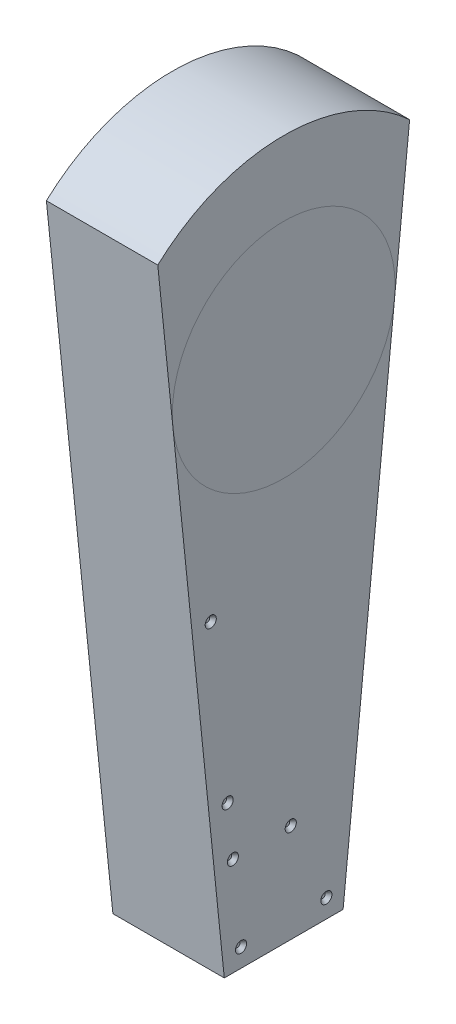
ISO-10303-21;
HEADER;
FILE_DESCRIPTION(('STEP AP214'),'2;1');
FILE_NAME('part.step','',(''),(''),'','','');
FILE_SCHEMA(('AUTOMOTIVE_DESIGN { 1 0 10303 214 1 1 1 1 }'));
ENDSEC;
DATA;
#1=APPLICATION_CONTEXT('core data for automotive mechanical design processes');
#2=APPLICATION_PROTOCOL_DEFINITION('international standard','automotive_design',2000,#1);
#3=PRODUCT_CONTEXT('',#1,'mechanical');
#4=PRODUCT('Part','Part','',(#3));
#5=PRODUCT_RELATED_PRODUCT_CATEGORY('part','',(#4));
#6=PRODUCT_DEFINITION_FORMATION('','',#4);
#7=PRODUCT_DEFINITION_CONTEXT('part definition',#1,'design');
#8=PRODUCT_DEFINITION('design','',#6,#7);
#9=PRODUCT_DEFINITION_SHAPE('','',#8);
#10=(LENGTH_UNIT() NAMED_UNIT(*) SI_UNIT(.MILLI.,.METRE.));
#11=(NAMED_UNIT(*) PLANE_ANGLE_UNIT() SI_UNIT($,.RADIAN.));
#12=(NAMED_UNIT(*) SI_UNIT($,.STERADIAN.) SOLID_ANGLE_UNIT());
#13=UNCERTAINTY_MEASURE_WITH_UNIT(LENGTH_MEASURE(1.E-05),#10,'distance_accuracy_value','');
#14=(GEOMETRIC_REPRESENTATION_CONTEXT(3) GLOBAL_UNCERTAINTY_ASSIGNED_CONTEXT((#13)) GLOBAL_UNIT_ASSIGNED_CONTEXT((#10,
#11,#12)) REPRESENTATION_CONTEXT('',''));
#15=CARTESIAN_POINT('',(0.,0.,0.));
#16=DIRECTION('',(0.,0.,1.));
#17=DIRECTION('',(1.,0.,0.));
#18=AXIS2_PLACEMENT_3D('',#15,#16,#17);
#19=CARTESIAN_POINT('',(76.2,-351.790000010146,40.64));
#20=DIRECTION('',(0.,1.,0.));
#21=DIRECTION('',(0.,0.,1.));
#22=AXIS2_PLACEMENT_3D('',#19,#20,#21);
#23=PLANE('',#22);
#24=DIRECTION('',(0.,0.,-1.));
#25=VECTOR('',#24,1.);
#26=CARTESIAN_POINT('',(0.,-351.790000010146,40.64));
#27=LINE('',#26,#25);
#28=CARTESIAN_POINT('',(0.,-351.790000010146,40.64));
#29=VERTEX_POINT('',#28);
#30=CARTESIAN_POINT('',(0.,-351.790000010146,-40.64));
#31=VERTEX_POINT('',#30);
#32=EDGE_CURVE('E101',#29,#31,#27,.T.);
#33=ORIENTED_EDGE('',*,*,#32,.T.);
#34=DIRECTION('',(-1.,0.,0.));
#35=VECTOR('',#34,1.);
#36=CARTESIAN_POINT('',(76.2,-351.790000010146,-40.64));
#37=LINE('',#36,#35);
#38=CARTESIAN_POINT('',(76.2,-351.790000010146,-40.64));
#39=VERTEX_POINT('',#38);
#40=EDGE_CURVE('E83',#39,#31,#37,.T.);
#41=ORIENTED_EDGE('',*,*,#40,.F.);
#42=DIRECTION('',(0.,0.,-1.));
#43=VECTOR('',#42,1.);
#44=CARTESIAN_POINT('',(76.2,-351.790000010146,40.64));
#45=LINE('',#44,#43);
#46=CARTESIAN_POINT('',(76.2,-351.790000010146,40.64));
#47=VERTEX_POINT('',#46);
#48=EDGE_CURVE('E90',#47,#39,#45,.T.);
#49=ORIENTED_EDGE('',*,*,#48,.F.);
#50=DIRECTION('',(-1.,0.,0.));
#51=VECTOR('',#50,1.);
#52=CARTESIAN_POINT('',(76.2,-351.790000010146,40.64));
#53=LINE('',#52,#51);
#54=EDGE_CURVE('E112',#47,#29,#53,.T.);
#55=ORIENTED_EDGE('',*,*,#54,.T.);
#56=EDGE_LOOP('',(#33,#41,#49,#55));
#57=FACE_BOUND('',#56,.T.);
#58=CARTESIAN_POINT('',(38.1,-351.790000010146,0.));
#59=DIRECTION('',(0.,1.,0.));
#60=DIRECTION('',(0.,0.,1.));
#61=AXIS2_PLACEMENT_3D('',#58,#59,#60);
#62=CIRCLE('',#61,25.4);
#63=CARTESIAN_POINT('',(38.1,-351.790000010146,25.4));
#64=VERTEX_POINT('',#63);
#65=EDGE_CURVE('E11',#64,#64,#62,.F.);
#66=ORIENTED_EDGE('',*,*,#65,.F.);
#67=EDGE_LOOP('',(#66));
#68=FACE_BOUND('',#67,.T.);
#69=ADVANCED_FACE('F34',(#57,#68),#23,.F.);
#70=CARTESIAN_POINT('',(76.2,0.,0.));
#71=DIRECTION('',(1.,0.,0.));
#72=DIRECTION('',(0.,0.,-1.));
#73=AXIS2_PLACEMENT_3D('',#70,#71,#72);
#74=PLANE('',#73);
#75=CARTESIAN_POINT('',(76.2,-284.339077712489,-4.8194607374854));
#76=DIRECTION('',(1.,0.,0.));
#77=DIRECTION('',(0.,0.,-1.));
#78=AXIS2_PLACEMENT_3D('',#75,#76,#77);
#79=CIRCLE('',#78,3.81);
#80=CARTESIAN_POINT('',(76.2,-284.339077712489,-8.6294607374854));
#81=VERTEX_POINT('',#80);
#82=EDGE_CURVE('E157',#81,#81,#79,.T.);
#83=ORIENTED_EDGE('',*,*,#82,.F.);
#84=EDGE_LOOP('',(#83));
#85=FACE_BOUND('',#84,.T.);
#86=CARTESIAN_POINT('',(76.2,-339.090000010146,-29.1719194246492));
#87=DIRECTION('',(1.,0.,0.));
#88=DIRECTION('',(0.,0.,-1.));
#89=AXIS2_PLACEMENT_3D('',#86,#87,#88);
#90=CIRCLE('',#89,3.80999999999999);
#91=CARTESIAN_POINT('',(76.2,-339.090000010146,-32.9819194246492));
#92=VERTEX_POINT('',#91);
#93=EDGE_CURVE('E151',#92,#92,#90,.T.);
#94=ORIENTED_EDGE('',*,*,#93,.F.);
#95=EDGE_LOOP('',(#94));
#96=FACE_BOUND('',#95,.T.);
#97=CARTESIAN_POINT('',(76.2,-339.090000010146,29.1719194246491));
#98=DIRECTION('',(1.,0.,0.));
#99=DIRECTION('',(0.,0.,-1.));
#100=AXIS2_PLACEMENT_3D('',#97,#98,#99);
#101=CIRCLE('',#100,3.81);
#102=CARTESIAN_POINT('',(76.2,-339.090000010146,25.3619194246491));
#103=VERTEX_POINT('',#102);
#104=EDGE_CURVE('E145',#103,#103,#101,.T.);
#105=ORIENTED_EDGE('',*,*,#104,.F.);
#106=EDGE_LOOP('',(#105));
#107=FACE_BOUND('',#106,.T.);
#108=CARTESIAN_POINT('',(76.2,-284.339077712489,34.768096530757));
#109=DIRECTION('',(1.,0.,0.));
#110=DIRECTION('',(0.,0.,-1.));
#111=AXIS2_PLACEMENT_3D('',#108,#109,#110);
#112=CIRCLE('',#111,3.81);
#113=CARTESIAN_POINT('',(76.2,-284.339077712489,30.958096530757));
#114=VERTEX_POINT('',#113);
#115=EDGE_CURVE('E139',#114,#114,#112,.T.);
#116=ORIENTED_EDGE('',*,*,#115,.F.);
#117=EDGE_LOOP('',(#116));
#118=FACE_BOUND('',#117,.T.);
#119=CARTESIAN_POINT('',(76.2,-249.174001321091,38.3623737991144));
#120=DIRECTION('',(1.,0.,0.));
#121=DIRECTION('',(0.,0.,-1.));
#122=AXIS2_PLACEMENT_3D('',#119,#120,#121);
#123=CIRCLE('',#122,3.81);
#124=CARTESIAN_POINT('',(76.2,-249.174001321091,34.5523737991144));
#125=VERTEX_POINT('',#124);
#126=EDGE_CURVE('E133',#125,#125,#123,.T.);
#127=ORIENTED_EDGE('',*,*,#126,.F.);
#128=EDGE_LOOP('',(#127));
#129=FACE_BOUND('',#128,.T.);
#130=CARTESIAN_POINT('',(76.2,-136.12684472737,49.9170998766228));
#131=DIRECTION('',(1.,0.,0.));
#132=DIRECTION('',(0.,0.,-1.));
#133=AXIS2_PLACEMENT_3D('',#130,#131,#132);
#134=CIRCLE('',#133,3.81);
#135=CARTESIAN_POINT('',(76.2,-136.12684472737,46.1070998766228));
#136=VERTEX_POINT('',#135);
#137=EDGE_CURVE('E127',#136,#136,#134,.T.);
#138=ORIENTED_EDGE('',*,*,#137,.F.);
#139=EDGE_LOOP('',(#138));
#140=FACE_BOUND('',#139,.T.);
#141=DIRECTION('',(0.,0.994816974553797,-0.101681793550419));
#142=VECTOR('',#141,1.);
#143=CARTESIAN_POINT('',(76.2,-351.790000010146,-40.64));
#144=LINE('',#143,#142);
#145=CARTESIAN_POINT('',(76.2,-7.74815266854194,-75.8050534609993));
#146=VERTEX_POINT('',#145);
#147=EDGE_CURVE('E79',#39,#146,#144,.T.);
#148=ORIENTED_EDGE('',*,*,#147,.T.);
#149=CARTESIAN_POINT('',(76.2,0.,0.));
#150=DIRECTION('',(1.,0.,0.));
#151=DIRECTION('',(0.,0.,-1.));
#152=AXIS2_PLACEMENT_3D('',#149,#150,#151);
#153=CIRCLE('',#152,76.2);
#154=CARTESIAN_POINT('',(76.2,-7.74815266854197,75.8050534609993));
#155=VERTEX_POINT('',#154);
#156=EDGE_CURVE('E43',#146,#155,#153,.F.);
#157=ORIENTED_EDGE('',*,*,#156,.T.);
#158=DIRECTION('',(0.,-0.994816974553797,-0.101681793550419));
#159=VECTOR('',#158,1.);
#160=CARTESIAN_POINT('',(76.2,-351.790000010146,40.64));
#161=LINE('',#160,#159);
#162=EDGE_CURVE('E93',#155,#47,#161,.T.);
#163=ORIENTED_EDGE('',*,*,#162,.T.);
#164=ORIENTED_EDGE('',*,*,#48,.T.);
#165=EDGE_LOOP('',(#148,#157,#163,#164));
#166=FACE_BOUND('',#165,.T.);
#167=ADVANCED_FACE('F91',(#85,#96,#107,#118,#129,#140,#166),#74,.T.);
#168=CARTESIAN_POINT('',(76.2,93.3252519461238,86.1359236857219));
#169=VERTEX_POINT('',#168);
#170=EDGE_CURVE('E114',#169,#155,#161,.T.);
#171=ORIENTED_EDGE('',*,*,#170,.T.);
#172=EDGE_CURVE('E102',#155,#146,#153,.F.);
#173=ORIENTED_EDGE('',*,*,#172,.T.);
#174=CARTESIAN_POINT('',(76.2,93.3252519461238,-86.1359236857219));
#175=VERTEX_POINT('',#174);
#176=EDGE_CURVE('E86',#146,#175,#144,.T.);
#177=ORIENTED_EDGE('',*,*,#176,.T.);
#178=CARTESIAN_POINT('',(76.2,0.,0.));
#179=DIRECTION('',(1.,0.,0.));
#180=DIRECTION('',(0.,0.,-1.));
#181=AXIS2_PLACEMENT_3D('',#178,#179,#180);
#182=CIRCLE('',#181,127.);
#183=EDGE_CURVE('E87',#175,#169,#182,.T.);
#184=ORIENTED_EDGE('',*,*,#183,.T.);
#185=EDGE_LOOP('',(#171,#173,#177,#184));
#186=FACE_BOUND('',#185,.T.);
#187=ADVANCED_FACE('F247',(#186),#74,.T.);
#188=ORIENTED_EDGE('',*,*,#65,.T.);
#189=EDGE_LOOP('',(#188));
#190=FACE_BOUND('',#189,.T.);
#191=ADVANCED_FACE('F36',(#190),#23,.F.);
#192=CARTESIAN_POINT('',(76.2,-351.790000010146,-40.64));
#193=DIRECTION('',(0.,0.101681793550419,0.994816974553797));
#194=DIRECTION('',(0.,-0.994816974553797,0.101681793550419));
#195=AXIS2_PLACEMENT_3D('',#192,#193,#194);
#196=PLANE('',#195);
#197=DIRECTION('',(0.,0.994816974553797,-0.101681793550419));
#198=VECTOR('',#197,1.);
#199=CARTESIAN_POINT('',(0.,-351.790000010146,-40.64));
#200=LINE('',#199,#198);
#201=CARTESIAN_POINT('',(0.,93.3252519461238,-86.1359236857219));
#202=VERTEX_POINT('',#201);
#203=EDGE_CURVE('E118',#31,#202,#200,.T.);
#204=ORIENTED_EDGE('',*,*,#203,.T.);
#205=DIRECTION('',(-1.,0.,0.));
#206=VECTOR('',#205,1.);
#207=CARTESIAN_POINT('',(76.2,93.3252519461238,-86.1359236857219));
#208=LINE('',#207,#206);
#209=EDGE_CURVE('E103',#175,#202,#208,.T.);
#210=ORIENTED_EDGE('',*,*,#209,.F.);
#211=ORIENTED_EDGE('',*,*,#176,.F.);
#212=ORIENTED_EDGE('',*,*,#147,.F.);
#213=ORIENTED_EDGE('',*,*,#40,.T.);
#214=EDGE_LOOP('',(#204,#210,#211,#212,#213));
#215=FACE_BOUND('',#214,.T.);
#216=ADVANCED_FACE('F81',(#215),#196,.F.);
#217=CARTESIAN_POINT('',(76.2,0.,0.));
#218=DIRECTION('',(-1.,0.,0.));
#219=DIRECTION('',(0.,0.,1.));
#220=AXIS2_PLACEMENT_3D('',#217,#218,#219);
#221=CYLINDRICAL_SURFACE('',#220,127.);
#222=CARTESIAN_POINT('',(0.,0.,0.));
#223=DIRECTION('',(1.,0.,0.));
#224=DIRECTION('',(0.,0.,-1.));
#225=AXIS2_PLACEMENT_3D('',#222,#223,#224);
#226=CIRCLE('',#225,127.);
#227=CARTESIAN_POINT('',(0.,93.3252519461238,86.1359236857219));
#228=VERTEX_POINT('',#227);
#229=EDGE_CURVE('E116',#202,#228,#226,.T.);
#230=ORIENTED_EDGE('',*,*,#229,.T.);
#231=DIRECTION('',(-1.,0.,0.));
#232=VECTOR('',#231,1.);
#233=CARTESIAN_POINT('',(76.2,93.3252519461238,86.1359236857219));
#234=LINE('',#233,#232);
#235=EDGE_CURVE('E107',#169,#228,#234,.T.);
#236=ORIENTED_EDGE('',*,*,#235,.F.);
#237=ORIENTED_EDGE('',*,*,#183,.F.);
#238=ORIENTED_EDGE('',*,*,#209,.T.);
#239=EDGE_LOOP('',(#230,#236,#237,#238));
#240=FACE_BOUND('',#239,.T.);
#241=ADVANCED_FACE('F243',(#240),#221,.T.);
#242=CARTESIAN_POINT('',(76.2,-351.790000010146,40.64));
#243=DIRECTION('',(0.,0.101681793550419,-0.994816974553797));
#244=DIRECTION('',(0.,0.994816974553797,0.10168179355042));
#245=AXIS2_PLACEMENT_3D('',#242,#243,#244);
#246=PLANE('',#245);
#247=DIRECTION('',(0.,-0.994816974553797,-0.101681793550419));
#248=VECTOR('',#247,1.);
#249=CARTESIAN_POINT('',(0.,-351.790000010146,40.64));
#250=LINE('',#249,#248);
#251=EDGE_CURVE('E97',#228,#29,#250,.T.);
#252=ORIENTED_EDGE('',*,*,#251,.T.);
#253=ORIENTED_EDGE('',*,*,#54,.F.);
#254=ORIENTED_EDGE('',*,*,#162,.F.);
#255=ORIENTED_EDGE('',*,*,#170,.F.);
#256=ORIENTED_EDGE('',*,*,#235,.T.);
#257=EDGE_LOOP('',(#252,#253,#254,#255,#256));
#258=FACE_BOUND('',#257,.T.);
#259=ADVANCED_FACE('F249',(#258),#246,.F.);
#260=ORIENTED_EDGE('',*,*,#156,.F.);
#261=ORIENTED_EDGE('',*,*,#172,.F.);
#262=EDGE_LOOP('',(#260,#261));
#263=FACE_BOUND('',#262,.T.);
#264=ADVANCED_FACE('F221',(#263),#74,.T.);
#265=CARTESIAN_POINT('',(0.,0.,0.));
#266=DIRECTION('',(1.,0.,0.));
#267=DIRECTION('',(0.,0.,-1.));
#268=AXIS2_PLACEMENT_3D('',#265,#266,#267);
#269=PLANE('',#268);
#270=CARTESIAN_POINT('',(0.,-152.285748197801,48.2654731666759));
#271=DIRECTION('',(-1.,0.,0.));
#272=DIRECTION('',(0.,0.,1.));
#273=AXIS2_PLACEMENT_3D('',#270,#271,#272);
#274=CIRCLE('',#273,3.81);
#275=CARTESIAN_POINT('',(0.,-152.285748197801,52.0754731666759));
#276=VERTEX_POINT('',#275);
#277=EDGE_CURVE('E211',#276,#276,#274,.T.);
#278=ORIENTED_EDGE('',*,*,#277,.F.);
#279=EDGE_LOOP('',(#278));
#280=FACE_BOUND('',#279,.T.);
#281=CARTESIAN_POINT('',(0.,57.9298746193023,69.7519396294631));
#282=DIRECTION('',(-1.,0.,0.));
#283=DIRECTION('',(0.,0.,1.));
#284=AXIS2_PLACEMENT_3D('',#281,#282,#283);
#285=CIRCLE('',#284,3.81);
#286=CARTESIAN_POINT('',(0.,57.9298746193023,73.5619396294631));
#287=VERTEX_POINT('',#286);
#288=EDGE_CURVE('E205',#287,#287,#285,.T.);
#289=ORIENTED_EDGE('',*,*,#288,.F.);
#290=EDGE_LOOP('',(#289));
#291=FACE_BOUND('',#290,.T.);
#292=CARTESIAN_POINT('',(0.,103.609527071582,48.2654731666759));
#293=DIRECTION('',(-1.,0.,0.));
#294=DIRECTION('',(0.,0.,1.));
#295=AXIS2_PLACEMENT_3D('',#292,#293,#294);
#296=CIRCLE('',#295,3.81);
#297=CARTESIAN_POINT('',(0.,103.609527071582,52.0754731666759));
#298=VERTEX_POINT('',#297);
#299=EDGE_CURVE('E199',#298,#298,#296,.T.);
#300=ORIENTED_EDGE('',*,*,#299,.F.);
#301=EDGE_LOOP('',(#300));
#302=FACE_BOUND('',#301,.T.);
#303=CARTESIAN_POINT('',(0.,103.609527071582,-48.265473166676));
#304=DIRECTION('',(-1.,0.,0.));
#305=DIRECTION('',(0.,0.,1.));
#306=AXIS2_PLACEMENT_3D('',#303,#304,#305);
#307=CIRCLE('',#306,3.81);
#308=CARTESIAN_POINT('',(0.,103.609527071582,-44.455473166676));
#309=VERTEX_POINT('',#308);
#310=EDGE_CURVE('E193',#309,#309,#307,.T.);
#311=ORIENTED_EDGE('',*,*,#310,.F.);
#312=EDGE_LOOP('',(#311));
#313=FACE_BOUND('',#312,.T.);
#314=CARTESIAN_POINT('',(0.,57.9298746193023,-69.7519396294631));
#315=DIRECTION('',(-1.,0.,0.));
#316=DIRECTION('',(0.,0.,1.));
#317=AXIS2_PLACEMENT_3D('',#314,#315,#316);
#318=CIRCLE('',#317,3.81);
#319=CARTESIAN_POINT('',(0.,57.9298746193023,-65.9419396294631));
#320=VERTEX_POINT('',#319);
#321=EDGE_CURVE('E187',#320,#320,#318,.T.);
#322=ORIENTED_EDGE('',*,*,#321,.F.);
#323=EDGE_LOOP('',(#322));
#324=FACE_BOUND('',#323,.T.);
#325=CARTESIAN_POINT('',(0.,-152.285748197801,-48.265473166676));
#326=DIRECTION('',(-1.,0.,0.));
#327=DIRECTION('',(0.,0.,1.));
#328=AXIS2_PLACEMENT_3D('',#325,#326,#327);
#329=CIRCLE('',#328,3.81);
#330=CARTESIAN_POINT('',(0.,-152.285748197801,-44.4554731666759));
#331=VERTEX_POINT('',#330);
#332=EDGE_CURVE('E181',#331,#331,#329,.T.);
#333=ORIENTED_EDGE('',*,*,#332,.F.);
#334=EDGE_LOOP('',(#333));
#335=FACE_BOUND('',#334,.T.);
#336=CARTESIAN_POINT('',(0.,-290.072249351584,-34.1821001214607));
#337=DIRECTION('',(-1.,0.,0.));
#338=DIRECTION('',(0.,0.,1.));
#339=AXIS2_PLACEMENT_3D('',#336,#337,#338);
#340=CIRCLE('',#339,3.81);
#341=CARTESIAN_POINT('',(0.,-290.072249351584,-30.3721001214607));
#342=VERTEX_POINT('',#341);
#343=EDGE_CURVE('E175',#342,#342,#340,.T.);
#344=ORIENTED_EDGE('',*,*,#343,.F.);
#345=EDGE_LOOP('',(#344));
#346=FACE_BOUND('',#345,.T.);
#347=CARTESIAN_POINT('',(0.,-339.090000010146,12.5568506506859));
#348=DIRECTION('',(-1.,0.,0.));
#349=DIRECTION('',(0.,0.,-1.));
#350=AXIS2_PLACEMENT_3D('',#347,#348,#349);
#351=CIRCLE('',#350,3.81);
#352=CARTESIAN_POINT('',(0.,-339.090000010146,8.74685065068594));
#353=VERTEX_POINT('',#352);
#354=EDGE_CURVE('E169',#353,#353,#351,.T.);
#355=ORIENTED_EDGE('',*,*,#354,.F.);
#356=EDGE_LOOP('',(#355));
#357=FACE_BOUND('',#356,.T.);
#358=CARTESIAN_POINT('',(0.,-339.090000010146,-12.556850650686));
#359=DIRECTION('',(-1.,0.,0.));
#360=DIRECTION('',(0.,0.,1.));
#361=AXIS2_PLACEMENT_3D('',#358,#359,#360);
#362=CIRCLE('',#361,3.81);
#363=CARTESIAN_POINT('',(0.,-339.090000010146,-8.746850650686));
#364=VERTEX_POINT('',#363);
#365=EDGE_CURVE('E163',#364,#364,#362,.T.);
#366=ORIENTED_EDGE('',*,*,#365,.F.);
#367=EDGE_LOOP('',(#366));
#368=FACE_BOUND('',#367,.T.);
#369=ORIENTED_EDGE('',*,*,#32,.F.);
#370=ORIENTED_EDGE('',*,*,#251,.F.);
#371=ORIENTED_EDGE('',*,*,#229,.F.);
#372=ORIENTED_EDGE('',*,*,#203,.F.);
#373=EDGE_LOOP('',(#369,#370,#371,#372));
#374=FACE_BOUND('',#373,.T.);
#375=ADVANCED_FACE('F217',(#280,#291,#302,#313,#324,#335,#346,#357,#368,#374),#269,.F.);
#376=CARTESIAN_POINT('',(76.2,-136.12684472737,49.9170998766228));
#377=DIRECTION('',(1.,0.,0.));
#378=DIRECTION('',(0.,0.,-1.));
#379=AXIS2_PLACEMENT_3D('',#376,#377,#378);
#380=CONICAL_SURFACE('',#379,3.81,0.680678408277789);
#381=CARTESIAN_POINT('',(73.66,-136.12684472737,49.9170998766228));
#382=DIRECTION('',(1.,0.,0.));
#383=DIRECTION('',(0.,0.,-1.));
#384=AXIS2_PLACEMENT_3D('',#381,#382,#383);
#385=CIRCLE('',#384,1.75314855568468);
#386=CARTESIAN_POINT('',(73.66,-136.12684472737,48.1639513209381));
#387=VERTEX_POINT('',#386);
#388=EDGE_CURVE('E121',#387,#387,#385,.T.);
#389=ORIENTED_EDGE('',*,*,#388,.F.);
#390=EDGE_LOOP('',(#389));
#391=FACE_BOUND('',#390,.T.);
#392=ORIENTED_EDGE('',*,*,#137,.T.);
#393=EDGE_LOOP('',(#392));
#394=FACE_BOUND('',#393,.T.);
#395=ADVANCED_FACE('F220',(#391,#394),#380,.F.);
#396=CARTESIAN_POINT('',(73.66,-136.12684472737,49.9170998766228));
#397=DIRECTION('',(1.,0.,0.));
#398=DIRECTION('',(0.,0.,-1.));
#399=AXIS2_PLACEMENT_3D('',#396,#397,#398);
#400=PLANE('',#399);
#401=ORIENTED_EDGE('',*,*,#388,.T.);
#402=EDGE_LOOP('',(#401));
#403=FACE_BOUND('',#402,.T.);
#404=ADVANCED_FACE('F275',(#403),#400,.T.);
#405=CARTESIAN_POINT('',(76.2,-249.174001321091,38.3623737991144));
#406=DIRECTION('',(1.,0.,0.));
#407=DIRECTION('',(0.,0.,-1.));
#408=AXIS2_PLACEMENT_3D('',#405,#406,#407);
#409=CONICAL_SURFACE('',#408,3.81,0.680678408277789);
#410=CARTESIAN_POINT('',(73.66,-249.174001321091,38.3623737991144));
#411=DIRECTION('',(1.,0.,0.));
#412=DIRECTION('',(0.,0.,-1.));
#413=AXIS2_PLACEMENT_3D('',#410,#411,#412);
#414=CIRCLE('',#413,1.75314855568468);
#415=CARTESIAN_POINT('',(73.66,-249.174001321091,36.6092252434297));
#416=VERTEX_POINT('',#415);
#417=EDGE_CURVE('E130',#416,#416,#414,.T.);
#418=ORIENTED_EDGE('',*,*,#417,.F.);
#419=EDGE_LOOP('',(#418));
#420=FACE_BOUND('',#419,.T.);
#421=ORIENTED_EDGE('',*,*,#126,.T.);
#422=EDGE_LOOP('',(#421));
#423=FACE_BOUND('',#422,.T.);
#424=ADVANCED_FACE('F279',(#420,#423),#409,.F.);
#425=CARTESIAN_POINT('',(73.66,-249.174001321091,38.3623737991144));
#426=DIRECTION('',(1.,0.,0.));
#427=DIRECTION('',(0.,0.,-1.));
#428=AXIS2_PLACEMENT_3D('',#425,#426,#427);
#429=PLANE('',#428);
#430=ORIENTED_EDGE('',*,*,#417,.T.);
#431=EDGE_LOOP('',(#430));
#432=FACE_BOUND('',#431,.T.);
#433=ADVANCED_FACE('F283',(#432),#429,.T.);
#434=CARTESIAN_POINT('',(76.2,-284.339077712489,34.768096530757));
#435=DIRECTION('',(1.,0.,0.));
#436=DIRECTION('',(0.,0.,-1.));
#437=AXIS2_PLACEMENT_3D('',#434,#435,#436);
#438=CONICAL_SURFACE('',#437,3.81,0.680678408277789);
#439=CARTESIAN_POINT('',(73.66,-284.339077712489,34.768096530757));
#440=DIRECTION('',(1.,0.,0.));
#441=DIRECTION('',(0.,0.,-1.));
#442=AXIS2_PLACEMENT_3D('',#439,#440,#441);
#443=CIRCLE('',#442,1.75314855568468);
#444=CARTESIAN_POINT('',(73.66,-284.339077712489,33.0149479750723));
#445=VERTEX_POINT('',#444);
#446=EDGE_CURVE('E136',#445,#445,#443,.T.);
#447=ORIENTED_EDGE('',*,*,#446,.F.);
#448=EDGE_LOOP('',(#447));
#449=FACE_BOUND('',#448,.T.);
#450=ORIENTED_EDGE('',*,*,#115,.T.);
#451=EDGE_LOOP('',(#450));
#452=FACE_BOUND('',#451,.T.);
#453=ADVANCED_FACE('F287',(#449,#452),#438,.F.);
#454=CARTESIAN_POINT('',(73.66,-284.339077712489,34.768096530757));
#455=DIRECTION('',(1.,0.,0.));
#456=DIRECTION('',(0.,0.,-1.));
#457=AXIS2_PLACEMENT_3D('',#454,#455,#456);
#458=PLANE('',#457);
#459=ORIENTED_EDGE('',*,*,#446,.T.);
#460=EDGE_LOOP('',(#459));
#461=FACE_BOUND('',#460,.T.);
#462=ADVANCED_FACE('F291',(#461),#458,.T.);
#463=CARTESIAN_POINT('',(76.2,-339.090000010146,29.1719194246491));
#464=DIRECTION('',(1.,0.,0.));
#465=DIRECTION('',(0.,0.,-1.));
#466=AXIS2_PLACEMENT_3D('',#463,#464,#465);
#467=CONICAL_SURFACE('',#466,3.81,0.680678408277789);
#468=CARTESIAN_POINT('',(73.66,-339.090000010146,29.1719194246491));
#469=DIRECTION('',(1.,0.,0.));
#470=DIRECTION('',(0.,0.,-1.));
#471=AXIS2_PLACEMENT_3D('',#468,#469,#470);
#472=CIRCLE('',#471,1.75314855568468);
#473=CARTESIAN_POINT('',(73.66,-339.090000010146,27.4187708689645));
#474=VERTEX_POINT('',#473);
#475=EDGE_CURVE('E142',#474,#474,#472,.T.);
#476=ORIENTED_EDGE('',*,*,#475,.F.);
#477=EDGE_LOOP('',(#476));
#478=FACE_BOUND('',#477,.T.);
#479=ORIENTED_EDGE('',*,*,#104,.T.);
#480=EDGE_LOOP('',(#479));
#481=FACE_BOUND('',#480,.T.);
#482=ADVANCED_FACE('F295',(#478,#481),#467,.F.);
#483=CARTESIAN_POINT('',(73.66,-339.090000010146,29.1719194246491));
#484=DIRECTION('',(1.,0.,0.));
#485=DIRECTION('',(0.,0.,-1.));
#486=AXIS2_PLACEMENT_3D('',#483,#484,#485);
#487=PLANE('',#486);
#488=ORIENTED_EDGE('',*,*,#475,.T.);
#489=EDGE_LOOP('',(#488));
#490=FACE_BOUND('',#489,.T.);
#491=ADVANCED_FACE('F299',(#490),#487,.T.);
#492=CARTESIAN_POINT('',(76.2,-339.090000010146,-29.1719194246492));
#493=DIRECTION('',(1.,0.,0.));
#494=DIRECTION('',(0.,0.,-1.));
#495=AXIS2_PLACEMENT_3D('',#492,#493,#494);
#496=CONICAL_SURFACE('',#495,3.80999999999999,0.680678408277789);
#497=CARTESIAN_POINT('',(73.66,-339.090000010146,-29.1719194246492));
#498=DIRECTION('',(1.,0.,0.));
#499=DIRECTION('',(0.,0.,-1.));
#500=AXIS2_PLACEMENT_3D('',#497,#498,#499);
#501=CIRCLE('',#500,1.75314855568467);
#502=CARTESIAN_POINT('',(73.66,-339.090000010146,-30.9250679803339));
#503=VERTEX_POINT('',#502);
#504=EDGE_CURVE('E148',#503,#503,#501,.T.);
#505=ORIENTED_EDGE('',*,*,#504,.F.);
#506=EDGE_LOOP('',(#505));
#507=FACE_BOUND('',#506,.T.);
#508=ORIENTED_EDGE('',*,*,#93,.T.);
#509=EDGE_LOOP('',(#508));
#510=FACE_BOUND('',#509,.T.);
#511=ADVANCED_FACE('F303',(#507,#510),#496,.F.);
#512=CARTESIAN_POINT('',(73.66,-339.090000010146,-29.1719194246492));
#513=DIRECTION('',(1.,0.,0.));
#514=DIRECTION('',(0.,0.,-1.));
#515=AXIS2_PLACEMENT_3D('',#512,#513,#514);
#516=PLANE('',#515);
#517=ORIENTED_EDGE('',*,*,#504,.T.);
#518=EDGE_LOOP('',(#517));
#519=FACE_BOUND('',#518,.T.);
#520=ADVANCED_FACE('F307',(#519),#516,.T.);
#521=CARTESIAN_POINT('',(76.2,-284.339077712489,-4.8194607374854));
#522=DIRECTION('',(1.,0.,0.));
#523=DIRECTION('',(0.,0.,-1.));
#524=AXIS2_PLACEMENT_3D('',#521,#522,#523);
#525=CONICAL_SURFACE('',#524,3.81,0.680678408277789);
#526=CARTESIAN_POINT('',(73.66,-284.339077712489,-4.8194607374854));
#527=DIRECTION('',(1.,0.,0.));
#528=DIRECTION('',(0.,0.,-1.));
#529=AXIS2_PLACEMENT_3D('',#526,#527,#528);
#530=CIRCLE('',#529,1.75314855568468);
#531=CARTESIAN_POINT('',(73.66,-284.339077712489,-6.57260929317008));
#532=VERTEX_POINT('',#531);
#533=EDGE_CURVE('E154',#532,#532,#530,.T.);
#534=ORIENTED_EDGE('',*,*,#533,.F.);
#535=EDGE_LOOP('',(#534));
#536=FACE_BOUND('',#535,.T.);
#537=ORIENTED_EDGE('',*,*,#82,.T.);
#538=EDGE_LOOP('',(#537));
#539=FACE_BOUND('',#538,.T.);
#540=ADVANCED_FACE('F311',(#536,#539),#525,.F.);
#541=CARTESIAN_POINT('',(73.66,-284.339077712489,-4.8194607374854));
#542=DIRECTION('',(1.,0.,0.));
#543=DIRECTION('',(0.,0.,-1.));
#544=AXIS2_PLACEMENT_3D('',#541,#542,#543);
#545=PLANE('',#544);
#546=ORIENTED_EDGE('',*,*,#533,.T.);
#547=EDGE_LOOP('',(#546));
#548=FACE_BOUND('',#547,.T.);
#549=ADVANCED_FACE('F315',(#548),#545,.T.);
#550=CARTESIAN_POINT('',(0.,-339.090000010146,-12.556850650686));
#551=DIRECTION('',(-1.,0.,0.));
#552=DIRECTION('',(0.,0.,1.));
#553=AXIS2_PLACEMENT_3D('',#550,#551,#552);
#554=CONICAL_SURFACE('',#553,3.81,0.680678408277789);
#555=CARTESIAN_POINT('',(2.54,-339.090000010146,-12.556850650686));
#556=DIRECTION('',(-1.,0.,0.));
#557=DIRECTION('',(0.,0.,1.));
#558=AXIS2_PLACEMENT_3D('',#555,#556,#557);
#559=CIRCLE('',#558,1.75314855568468);
#560=CARTESIAN_POINT('',(2.54,-339.090000010146,-10.8037020950013));
#561=VERTEX_POINT('',#560);
#562=EDGE_CURVE('E160',#561,#561,#559,.T.);
#563=ORIENTED_EDGE('',*,*,#562,.F.);
#564=EDGE_LOOP('',(#563));
#565=FACE_BOUND('',#564,.T.);
#566=ORIENTED_EDGE('',*,*,#365,.T.);
#567=EDGE_LOOP('',(#566));
#568=FACE_BOUND('',#567,.T.);
#569=ADVANCED_FACE('F319',(#565,#568),#554,.F.);
#570=CARTESIAN_POINT('',(2.54,-339.090000010146,-12.556850650686));
#571=DIRECTION('',(-1.,0.,0.));
#572=DIRECTION('',(0.,0.,1.));
#573=AXIS2_PLACEMENT_3D('',#570,#571,#572);
#574=PLANE('',#573);
#575=ORIENTED_EDGE('',*,*,#562,.T.);
#576=EDGE_LOOP('',(#575));
#577=FACE_BOUND('',#576,.T.);
#578=ADVANCED_FACE('F323',(#577),#574,.T.);
#579=CARTESIAN_POINT('',(0.,-339.090000010146,12.5568506506859));
#580=DIRECTION('',(-1.,0.,0.));
#581=DIRECTION('',(0.,0.,-1.));
#582=AXIS2_PLACEMENT_3D('',#579,#580,#581);
#583=CONICAL_SURFACE('',#582,3.81,0.680678408277789);
#584=CARTESIAN_POINT('',(2.54,-339.090000010146,12.5568506506859));
#585=DIRECTION('',(1.,0.,0.));
#586=DIRECTION('',(0.,0.,-1.));
#587=AXIS2_PLACEMENT_3D('',#584,#585,#586);
#588=CIRCLE('',#587,1.75314855568468);
#589=CARTESIAN_POINT('',(2.54,-339.090000010146,10.8037020950013));
#590=VERTEX_POINT('',#589);
#591=EDGE_CURVE('E166',#590,#590,#588,.F.);
#592=ORIENTED_EDGE('',*,*,#591,.F.);
#593=EDGE_LOOP('',(#592));
#594=FACE_BOUND('',#593,.T.);
#595=ORIENTED_EDGE('',*,*,#354,.T.);
#596=EDGE_LOOP('',(#595));
#597=FACE_BOUND('',#596,.T.);
#598=ADVANCED_FACE('F327',(#594,#597),#583,.F.);
#599=CARTESIAN_POINT('',(2.54,-339.090000010146,12.5568506506859));
#600=DIRECTION('',(1.,0.,0.));
#601=DIRECTION('',(0.,0.,-1.));
#602=AXIS2_PLACEMENT_3D('',#599,#600,#601);
#603=PLANE('',#602);
#604=ORIENTED_EDGE('',*,*,#591,.T.);
#605=EDGE_LOOP('',(#604));
#606=FACE_BOUND('',#605,.T.);
#607=ADVANCED_FACE('F331',(#606),#603,.F.);
#608=CARTESIAN_POINT('',(0.,-290.072249351584,-34.1821001214607));
#609=DIRECTION('',(-1.,0.,0.));
#610=DIRECTION('',(0.,0.,1.));
#611=AXIS2_PLACEMENT_3D('',#608,#609,#610);
#612=CONICAL_SURFACE('',#611,3.81,0.680678408277789);
#613=CARTESIAN_POINT('',(2.54,-290.072249351584,-34.1821001214607));
#614=DIRECTION('',(-1.,0.,0.));
#615=DIRECTION('',(0.,0.,1.));
#616=AXIS2_PLACEMENT_3D('',#613,#614,#615);
#617=CIRCLE('',#616,1.75314855568468);
#618=CARTESIAN_POINT('',(2.54,-290.072249351584,-32.4289515657761));
#619=VERTEX_POINT('',#618);
#620=EDGE_CURVE('E172',#619,#619,#617,.T.);
#621=ORIENTED_EDGE('',*,*,#620,.F.);
#622=EDGE_LOOP('',(#621));
#623=FACE_BOUND('',#622,.T.);
#624=ORIENTED_EDGE('',*,*,#343,.T.);
#625=EDGE_LOOP('',(#624));
#626=FACE_BOUND('',#625,.T.);
#627=ADVANCED_FACE('F335',(#623,#626),#612,.F.);
#628=CARTESIAN_POINT('',(2.54,-290.072249351584,-34.1821001214607));
#629=DIRECTION('',(-1.,0.,0.));
#630=DIRECTION('',(0.,0.,1.));
#631=AXIS2_PLACEMENT_3D('',#628,#629,#630);
#632=PLANE('',#631);
#633=ORIENTED_EDGE('',*,*,#620,.T.);
#634=EDGE_LOOP('',(#633));
#635=FACE_BOUND('',#634,.T.);
#636=ADVANCED_FACE('F339',(#635),#632,.T.);
#637=CARTESIAN_POINT('',(0.,-152.285748197801,-48.265473166676));
#638=DIRECTION('',(-1.,0.,0.));
#639=DIRECTION('',(0.,0.,1.));
#640=AXIS2_PLACEMENT_3D('',#637,#638,#639);
#641=CONICAL_SURFACE('',#640,3.81,0.680678408277789);
#642=CARTESIAN_POINT('',(2.54,-152.285748197801,-48.265473166676));
#643=DIRECTION('',(-1.,0.,0.));
#644=DIRECTION('',(0.,0.,1.));
#645=AXIS2_PLACEMENT_3D('',#642,#643,#644);
#646=CIRCLE('',#645,1.75314855568468);
#647=CARTESIAN_POINT('',(2.54,-152.285748197801,-46.5123246109913));
#648=VERTEX_POINT('',#647);
#649=EDGE_CURVE('E178',#648,#648,#646,.T.);
#650=ORIENTED_EDGE('',*,*,#649,.F.);
#651=EDGE_LOOP('',(#650));
#652=FACE_BOUND('',#651,.T.);
#653=ORIENTED_EDGE('',*,*,#332,.T.);
#654=EDGE_LOOP('',(#653));
#655=FACE_BOUND('',#654,.T.);
#656=ADVANCED_FACE('F343',(#652,#655),#641,.F.);
#657=CARTESIAN_POINT('',(2.54,-152.285748197801,-48.265473166676));
#658=DIRECTION('',(-1.,0.,0.));
#659=DIRECTION('',(0.,0.,1.));
#660=AXIS2_PLACEMENT_3D('',#657,#658,#659);
#661=PLANE('',#660);
#662=ORIENTED_EDGE('',*,*,#649,.T.);
#663=EDGE_LOOP('',(#662));
#664=FACE_BOUND('',#663,.T.);
#665=ADVANCED_FACE('F347',(#664),#661,.T.);
#666=CARTESIAN_POINT('',(0.,57.9298746193023,-69.7519396294631));
#667=DIRECTION('',(-1.,0.,0.));
#668=DIRECTION('',(0.,0.,1.));
#669=AXIS2_PLACEMENT_3D('',#666,#667,#668);
#670=CONICAL_SURFACE('',#669,3.81,0.680678408277789);
#671=CARTESIAN_POINT('',(2.54,57.9298746193023,-69.7519396294631));
#672=DIRECTION('',(-1.,0.,0.));
#673=DIRECTION('',(0.,0.,1.));
#674=AXIS2_PLACEMENT_3D('',#671,#672,#673);
#675=CIRCLE('',#674,1.75314855568468);
#676=CARTESIAN_POINT('',(2.54,57.9298746193023,-67.9987910737784));
#677=VERTEX_POINT('',#676);
#678=EDGE_CURVE('E184',#677,#677,#675,.T.);
#679=ORIENTED_EDGE('',*,*,#678,.F.);
#680=EDGE_LOOP('',(#679));
#681=FACE_BOUND('',#680,.T.);
#682=ORIENTED_EDGE('',*,*,#321,.T.);
#683=EDGE_LOOP('',(#682));
#684=FACE_BOUND('',#683,.T.);
#685=ADVANCED_FACE('F351',(#681,#684),#670,.F.);
#686=CARTESIAN_POINT('',(2.54,57.9298746193023,-69.7519396294631));
#687=DIRECTION('',(-1.,0.,0.));
#688=DIRECTION('',(0.,0.,1.));
#689=AXIS2_PLACEMENT_3D('',#686,#687,#688);
#690=PLANE('',#689);
#691=ORIENTED_EDGE('',*,*,#678,.T.);
#692=EDGE_LOOP('',(#691));
#693=FACE_BOUND('',#692,.T.);
#694=ADVANCED_FACE('F355',(#693),#690,.T.);
#695=CARTESIAN_POINT('',(0.,103.609527071582,-48.265473166676));
#696=DIRECTION('',(-1.,0.,0.));
#697=DIRECTION('',(0.,0.,1.));
#698=AXIS2_PLACEMENT_3D('',#695,#696,#697);
#699=CONICAL_SURFACE('',#698,3.81,0.680678408277789);
#700=CARTESIAN_POINT('',(2.54,103.609527071582,-48.265473166676));
#701=DIRECTION('',(-1.,0.,0.));
#702=DIRECTION('',(0.,0.,1.));
#703=AXIS2_PLACEMENT_3D('',#700,#701,#702);
#704=CIRCLE('',#703,1.75314855568468);
#705=CARTESIAN_POINT('',(2.54,103.609527071582,-46.5123246109913));
#706=VERTEX_POINT('',#705);
#707=EDGE_CURVE('E190',#706,#706,#704,.T.);
#708=ORIENTED_EDGE('',*,*,#707,.F.);
#709=EDGE_LOOP('',(#708));
#710=FACE_BOUND('',#709,.T.);
#711=ORIENTED_EDGE('',*,*,#310,.T.);
#712=EDGE_LOOP('',(#711));
#713=FACE_BOUND('',#712,.T.);
#714=ADVANCED_FACE('F359',(#710,#713),#699,.F.);
#715=CARTESIAN_POINT('',(2.54,103.609527071582,-48.265473166676));
#716=DIRECTION('',(-1.,0.,0.));
#717=DIRECTION('',(0.,0.,1.));
#718=AXIS2_PLACEMENT_3D('',#715,#716,#717);
#719=PLANE('',#718);
#720=ORIENTED_EDGE('',*,*,#707,.T.);
#721=EDGE_LOOP('',(#720));
#722=FACE_BOUND('',#721,.T.);
#723=ADVANCED_FACE('F363',(#722),#719,.T.);
#724=CARTESIAN_POINT('',(0.,103.609527071582,48.2654731666759));
#725=DIRECTION('',(-1.,0.,0.));
#726=DIRECTION('',(0.,0.,1.));
#727=AXIS2_PLACEMENT_3D('',#724,#725,#726);
#728=CONICAL_SURFACE('',#727,3.81,0.680678408277789);
#729=CARTESIAN_POINT('',(2.54,103.609527071582,48.2654731666759));
#730=DIRECTION('',(-1.,0.,0.));
#731=DIRECTION('',(0.,0.,1.));
#732=AXIS2_PLACEMENT_3D('',#729,#730,#731);
#733=CIRCLE('',#732,1.75314855568468);
#734=CARTESIAN_POINT('',(2.54,103.609527071582,50.0186217223606));
#735=VERTEX_POINT('',#734);
#736=EDGE_CURVE('E196',#735,#735,#733,.T.);
#737=ORIENTED_EDGE('',*,*,#736,.F.);
#738=EDGE_LOOP('',(#737));
#739=FACE_BOUND('',#738,.T.);
#740=ORIENTED_EDGE('',*,*,#299,.T.);
#741=EDGE_LOOP('',(#740));
#742=FACE_BOUND('',#741,.T.);
#743=ADVANCED_FACE('F367',(#739,#742),#728,.F.);
#744=CARTESIAN_POINT('',(2.54,103.609527071582,48.2654731666759));
#745=DIRECTION('',(-1.,0.,0.));
#746=DIRECTION('',(0.,0.,1.));
#747=AXIS2_PLACEMENT_3D('',#744,#745,#746);
#748=PLANE('',#747);
#749=ORIENTED_EDGE('',*,*,#736,.T.);
#750=EDGE_LOOP('',(#749));
#751=FACE_BOUND('',#750,.T.);
#752=ADVANCED_FACE('F371',(#751),#748,.T.);
#753=CARTESIAN_POINT('',(0.,57.9298746193023,69.7519396294631));
#754=DIRECTION('',(-1.,0.,0.));
#755=DIRECTION('',(0.,0.,1.));
#756=AXIS2_PLACEMENT_3D('',#753,#754,#755);
#757=CONICAL_SURFACE('',#756,3.81,0.680678408277789);
#758=CARTESIAN_POINT('',(2.54,57.9298746193023,69.7519396294631));
#759=DIRECTION('',(-1.,0.,0.));
#760=DIRECTION('',(0.,0.,1.));
#761=AXIS2_PLACEMENT_3D('',#758,#759,#760);
#762=CIRCLE('',#761,1.75314855568468);
#763=CARTESIAN_POINT('',(2.54,57.9298746193023,71.5050881851478));
#764=VERTEX_POINT('',#763);
#765=EDGE_CURVE('E202',#764,#764,#762,.T.);
#766=ORIENTED_EDGE('',*,*,#765,.F.);
#767=EDGE_LOOP('',(#766));
#768=FACE_BOUND('',#767,.T.);
#769=ORIENTED_EDGE('',*,*,#288,.T.);
#770=EDGE_LOOP('',(#769));
#771=FACE_BOUND('',#770,.T.);
#772=ADVANCED_FACE('F375',(#768,#771),#757,.F.);
#773=CARTESIAN_POINT('',(2.54,57.9298746193023,69.7519396294631));
#774=DIRECTION('',(-1.,0.,0.));
#775=DIRECTION('',(0.,0.,1.));
#776=AXIS2_PLACEMENT_3D('',#773,#774,#775);
#777=PLANE('',#776);
#778=ORIENTED_EDGE('',*,*,#765,.T.);
#779=EDGE_LOOP('',(#778));
#780=FACE_BOUND('',#779,.T.);
#781=ADVANCED_FACE('F379',(#780),#777,.T.);
#782=CARTESIAN_POINT('',(0.,-152.285748197801,48.2654731666759));
#783=DIRECTION('',(-1.,0.,0.));
#784=DIRECTION('',(0.,0.,1.));
#785=AXIS2_PLACEMENT_3D('',#782,#783,#784);
#786=CONICAL_SURFACE('',#785,3.81,0.680678408277789);
#787=CARTESIAN_POINT('',(2.54,-152.285748197801,48.2654731666759));
#788=DIRECTION('',(-1.,0.,0.));
#789=DIRECTION('',(0.,0.,1.));
#790=AXIS2_PLACEMENT_3D('',#787,#788,#789);
#791=CIRCLE('',#790,1.75314855568468);
#792=CARTESIAN_POINT('',(2.54,-152.285748197801,50.0186217223606));
#793=VERTEX_POINT('',#792);
#794=EDGE_CURVE('E208',#793,#793,#791,.T.);
#795=ORIENTED_EDGE('',*,*,#794,.F.);
#796=EDGE_LOOP('',(#795));
#797=FACE_BOUND('',#796,.T.);
#798=ORIENTED_EDGE('',*,*,#277,.T.);
#799=EDGE_LOOP('',(#798));
#800=FACE_BOUND('',#799,.T.);
#801=ADVANCED_FACE('F215',(#797,#800),#786,.F.);
#802=CARTESIAN_POINT('',(2.54,-152.285748197801,48.2654731666759));
#803=DIRECTION('',(-1.,0.,0.));
#804=DIRECTION('',(0.,0.,1.));
#805=AXIS2_PLACEMENT_3D('',#802,#803,#804);
#806=PLANE('',#805);
#807=ORIENTED_EDGE('',*,*,#794,.T.);
#808=EDGE_LOOP('',(#807));
#809=FACE_BOUND('',#808,.T.);
#810=ADVANCED_FACE('F386',(#809),#806,.T.);
#811=CLOSED_SHELL('',(#69,#167,#187,#191,#216,#241,#259,#264,#375,#395,#404,#424,#433,#453,#462,
#482,#491,#511,#520,#540,#549,#569,#578,#598,#607,#627,#636,#656,#665,#685,#694,#714,#723,#743,
#752,#772,#781,#801,#810));
#812=MANIFOLD_SOLID_BREP('B2',#811);
#813=ADVANCED_BREP_SHAPE_REPRESENTATION('',(#18,#812),#14);
#814=SHAPE_DEFINITION_REPRESENTATION(#9,#813);
ENDSEC;
END-ISO-10303-21;
